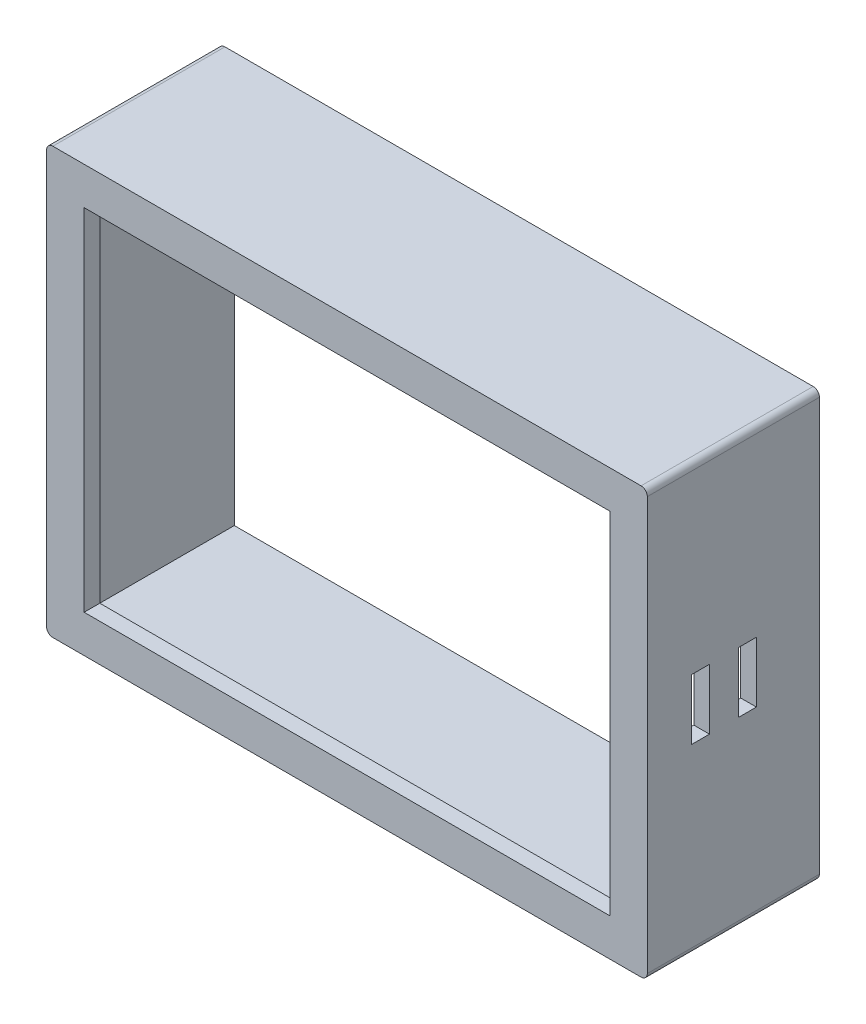
ISO-10303-21;
HEADER;
FILE_DESCRIPTION(('STEP AP214'),'2;1');
FILE_NAME('part.step','',(''),(''),'','','');
FILE_SCHEMA(('AUTOMOTIVE_DESIGN { 1 0 10303 214 1 1 1 1 }'));
ENDSEC;
DATA;
#1=APPLICATION_CONTEXT('core data for automotive mechanical design processes');
#2=APPLICATION_PROTOCOL_DEFINITION('international standard','automotive_design',2000,#1);
#3=PRODUCT_CONTEXT('',#1,'mechanical');
#4=PRODUCT('Part','Part','',(#3));
#5=PRODUCT_RELATED_PRODUCT_CATEGORY('part','',(#4));
#6=PRODUCT_DEFINITION_FORMATION('','',#4);
#7=PRODUCT_DEFINITION_CONTEXT('part definition',#1,'design');
#8=PRODUCT_DEFINITION('design','',#6,#7);
#9=PRODUCT_DEFINITION_SHAPE('','',#8);
#10=(LENGTH_UNIT() NAMED_UNIT(*) SI_UNIT(.MILLI.,.METRE.));
#11=(NAMED_UNIT(*) PLANE_ANGLE_UNIT() SI_UNIT($,.RADIAN.));
#12=(NAMED_UNIT(*) SI_UNIT($,.STERADIAN.) SOLID_ANGLE_UNIT());
#13=UNCERTAINTY_MEASURE_WITH_UNIT(LENGTH_MEASURE(1.E-05),#10,'distance_accuracy_value','');
#14=(GEOMETRIC_REPRESENTATION_CONTEXT(3) GLOBAL_UNCERTAINTY_ASSIGNED_CONTEXT((#13)) GLOBAL_UNIT_ASSIGNED_CONTEXT((#10,
#11,#12)) REPRESENTATION_CONTEXT('',''));
#15=CARTESIAN_POINT('',(0.,0.,0.));
#16=DIRECTION('',(0.,0.,1.));
#17=DIRECTION('',(1.,0.,0.));
#18=AXIS2_PLACEMENT_3D('',#15,#16,#17);
#19=CARTESIAN_POINT('',(-48.,34.,-2.5));
#20=DIRECTION('',(-1.,0.,0.));
#21=DIRECTION('',(0.,-1.,0.));
#22=AXIS2_PLACEMENT_3D('',#19,#20,#21);
#23=PLANE('',#22);
#24=DIRECTION('',(0.,1.,0.));
#25=VECTOR('',#24,1.);
#26=CARTESIAN_POINT('',(-48.,34.,-27.5));
#27=LINE('',#26,#25);
#28=CARTESIAN_POINT('',(-48.,-33.,-27.5));
#29=VERTEX_POINT('',#28);
#30=CARTESIAN_POINT('',(-48.,33.,-27.5));
#31=VERTEX_POINT('',#30);
#32=EDGE_CURVE('E293',#29,#31,#27,.T.);
#33=ORIENTED_EDGE('',*,*,#32,.F.);
#34=DIRECTION('',(0.,0.,1.));
#35=VECTOR('',#34,1.);
#36=CARTESIAN_POINT('',(-48.,-33.,-2.5));
#37=LINE('',#36,#35);
#38=CARTESIAN_POINT('',(-48.,-33.,0.));
#39=VERTEX_POINT('',#38);
#40=EDGE_CURVE('E351',#29,#39,#37,.T.);
#41=ORIENTED_EDGE('',*,*,#40,.T.);
#42=DIRECTION('',(0.,-1.,0.));
#43=VECTOR('',#42,1.);
#44=CARTESIAN_POINT('',(-48.,34.,0.));
#45=LINE('',#44,#43);
#46=CARTESIAN_POINT('',(-48.,33.,0.));
#47=VERTEX_POINT('',#46);
#48=EDGE_CURVE('E331',#47,#39,#45,.T.);
#49=ORIENTED_EDGE('',*,*,#48,.F.);
#50=DIRECTION('',(0.,0.,1.));
#51=VECTOR('',#50,1.);
#52=CARTESIAN_POINT('',(-48.,33.,-2.5));
#53=LINE('',#52,#51);
#54=EDGE_CURVE('E349',#47,#31,#53,.F.);
#55=ORIENTED_EDGE('',*,*,#54,.T.);
#56=EDGE_LOOP('',(#33,#41,#49,#55));
#57=FACE_BOUND('',#56,.T.);
#58=ADVANCED_FACE('F33',(#57),#23,.T.);
#59=CARTESIAN_POINT('',(-48.,34.,-2.5));
#60=DIRECTION('',(0.,1.,0.));
#61=DIRECTION('',(0.,0.,1.));
#62=AXIS2_PLACEMENT_3D('',#59,#60,#61);
#63=PLANE('',#62);
#64=DIRECTION('',(-1.,0.,0.));
#65=VECTOR('',#64,1.);
#66=CARTESIAN_POINT('',(-48.,34.,0.));
#67=LINE('',#66,#65);
#68=CARTESIAN_POINT('',(47.,34.,0.));
#69=VERTEX_POINT('',#68);
#70=CARTESIAN_POINT('',(-47.,34.,0.));
#71=VERTEX_POINT('',#70);
#72=EDGE_CURVE('E346',#69,#71,#67,.T.);
#73=ORIENTED_EDGE('',*,*,#72,.F.);
#74=DIRECTION('',(0.,0.,1.));
#75=VECTOR('',#74,1.);
#76=CARTESIAN_POINT('',(47.,34.,-2.5));
#77=LINE('',#76,#75);
#78=CARTESIAN_POINT('',(47.,34.,-27.5));
#79=VERTEX_POINT('',#78);
#80=EDGE_CURVE('E11',#69,#79,#77,.F.);
#81=ORIENTED_EDGE('',*,*,#80,.T.);
#82=DIRECTION('',(1.,0.,0.));
#83=VECTOR('',#82,1.);
#84=CARTESIAN_POINT('',(48.,34.,-27.5));
#85=LINE('',#84,#83);
#86=CARTESIAN_POINT('',(-47.,34.,-27.5));
#87=VERTEX_POINT('',#86);
#88=EDGE_CURVE('E296',#87,#79,#85,.T.);
#89=ORIENTED_EDGE('',*,*,#88,.F.);
#90=DIRECTION('',(0.,0.,1.));
#91=VECTOR('',#90,1.);
#92=CARTESIAN_POINT('',(-47.,34.,-2.5));
#93=LINE('',#92,#91);
#94=EDGE_CURVE('E41',#87,#71,#93,.T.);
#95=ORIENTED_EDGE('',*,*,#94,.T.);
#96=EDGE_LOOP('',(#73,#81,#89,#95));
#97=FACE_BOUND('',#96,.T.);
#98=ADVANCED_FACE('F384',(#97),#63,.T.);
#99=CARTESIAN_POINT('',(48.,34.,-2.5));
#100=DIRECTION('',(1.,0.,0.));
#101=DIRECTION('',(0.,1.,0.));
#102=AXIS2_PLACEMENT_3D('',#99,#100,#101);
#103=PLANE('',#102);
#104=DIRECTION('',(0.,0.,1.));
#105=VECTOR('',#104,1.);
#106=CARTESIAN_POINT('',(48.,4.83485360643903,-7.06477032196039));
#107=LINE('',#106,#105);
#108=CARTESIAN_POINT('',(48.,4.83485360643903,-9.92986875540593));
#109=VERTEX_POINT('',#108);
#110=CARTESIAN_POINT('',(48.,4.83485360643903,-7.06477032196039));
#111=VERTEX_POINT('',#110);
#112=EDGE_CURVE('E212',#109,#111,#107,.T.);
#113=ORIENTED_EDGE('',*,*,#112,.F.);
#114=DIRECTION('',(0.,1.,0.));
#115=VECTOR('',#114,1.);
#116=CARTESIAN_POINT('',(48.,4.83485360643903,-9.92986875540593));
#117=LINE('',#116,#115);
#118=CARTESIAN_POINT('',(48.,-4.83485360643902,-9.92986875540593));
#119=VERTEX_POINT('',#118);
#120=EDGE_CURVE('E223',#119,#109,#117,.T.);
#121=ORIENTED_EDGE('',*,*,#120,.F.);
#122=DIRECTION('',(0.,0.,-1.));
#123=VECTOR('',#122,1.);
#124=CARTESIAN_POINT('',(48.,-4.83485360643902,-7.06477032196039));
#125=LINE('',#124,#123);
#126=CARTESIAN_POINT('',(48.,-4.83485360643902,-7.06477032196039));
#127=VERTEX_POINT('',#126);
#128=EDGE_CURVE('E48',#127,#119,#125,.T.);
#129=ORIENTED_EDGE('',*,*,#128,.F.);
#130=DIRECTION('',(0.,-1.,0.));
#131=VECTOR('',#130,1.);
#132=CARTESIAN_POINT('',(48.,4.83485360643903,-7.06477032196039));
#133=LINE('',#132,#131);
#134=EDGE_CURVE('E219',#111,#127,#133,.T.);
#135=ORIENTED_EDGE('',*,*,#134,.F.);
#136=EDGE_LOOP('',(#113,#121,#129,#135));
#137=FACE_BOUND('',#136,.T.);
#138=DIRECTION('',(0.,1.,0.));
#139=VECTOR('',#138,1.);
#140=CARTESIAN_POINT('',(48.,4.83485360643903,-17.4298687554059));
#141=LINE('',#140,#139);
#142=CARTESIAN_POINT('',(48.,-4.83485360643902,-17.4298687554059));
#143=VERTEX_POINT('',#142);
#144=CARTESIAN_POINT('',(48.,4.83485360643903,-17.4298687554059));
#145=VERTEX_POINT('',#144);
#146=EDGE_CURVE('E239',#143,#145,#141,.T.);
#147=ORIENTED_EDGE('',*,*,#146,.F.);
#148=DIRECTION('',(0.,0.,-1.));
#149=VECTOR('',#148,1.);
#150=CARTESIAN_POINT('',(48.,-4.83485360643902,-14.5647703219604));
#151=LINE('',#150,#149);
#152=CARTESIAN_POINT('',(48.,-4.83485360643902,-14.5647703219604));
#153=VERTEX_POINT('',#152);
#154=EDGE_CURVE('E242',#153,#143,#151,.T.);
#155=ORIENTED_EDGE('',*,*,#154,.F.);
#156=DIRECTION('',(0.,-1.,0.));
#157=VECTOR('',#156,1.);
#158=CARTESIAN_POINT('',(48.,4.83485360643903,-14.5647703219604));
#159=LINE('',#158,#157);
#160=CARTESIAN_POINT('',(48.,4.83485360643903,-14.5647703219604));
#161=VERTEX_POINT('',#160);
#162=EDGE_CURVE('E56',#161,#153,#159,.T.);
#163=ORIENTED_EDGE('',*,*,#162,.F.);
#164=DIRECTION('',(0.,0.,1.));
#165=VECTOR('',#164,1.);
#166=CARTESIAN_POINT('',(48.,4.83485360643903,-14.5647703219604));
#167=LINE('',#166,#165);
#168=EDGE_CURVE('E236',#145,#161,#167,.T.);
#169=ORIENTED_EDGE('',*,*,#168,.F.);
#170=EDGE_LOOP('',(#147,#155,#163,#169));
#171=FACE_BOUND('',#170,.T.);
#172=DIRECTION('',(0.,1.,0.));
#173=VECTOR('',#172,1.);
#174=CARTESIAN_POINT('',(48.,34.,0.));
#175=LINE('',#174,#173);
#176=CARTESIAN_POINT('',(48.,-33.,0.));
#177=VERTEX_POINT('',#176);
#178=CARTESIAN_POINT('',(48.,33.,0.));
#179=VERTEX_POINT('',#178);
#180=EDGE_CURVE('E343',#177,#179,#175,.T.);
#181=ORIENTED_EDGE('',*,*,#180,.F.);
#182=DIRECTION('',(0.,0.,1.));
#183=VECTOR('',#182,1.);
#184=CARTESIAN_POINT('',(48.,-33.,-2.5));
#185=LINE('',#184,#183);
#186=CARTESIAN_POINT('',(48.,-33.,-27.5));
#187=VERTEX_POINT('',#186);
#188=EDGE_CURVE('E378',#177,#187,#185,.F.);
#189=ORIENTED_EDGE('',*,*,#188,.T.);
#190=DIRECTION('',(0.,-1.,0.));
#191=VECTOR('',#190,1.);
#192=CARTESIAN_POINT('',(48.,-34.,-27.5));
#193=LINE('',#192,#191);
#194=CARTESIAN_POINT('',(48.,33.,-27.5));
#195=VERTEX_POINT('',#194);
#196=EDGE_CURVE('E299',#195,#187,#193,.T.);
#197=ORIENTED_EDGE('',*,*,#196,.F.);
#198=DIRECTION('',(0.,0.,1.));
#199=VECTOR('',#198,1.);
#200=CARTESIAN_POINT('',(48.,33.,-2.5));
#201=LINE('',#200,#199);
#202=EDGE_CURVE('E375',#195,#179,#201,.T.);
#203=ORIENTED_EDGE('',*,*,#202,.T.);
#204=EDGE_LOOP('',(#181,#189,#197,#203));
#205=FACE_BOUND('',#204,.T.);
#206=ADVANCED_FACE('F398',(#137,#171,#205),#103,.T.);
#207=CARTESIAN_POINT('',(-48.,-34.,-2.5));
#208=DIRECTION('',(0.,-1.,0.));
#209=DIRECTION('',(0.,0.,-1.));
#210=AXIS2_PLACEMENT_3D('',#207,#208,#209);
#211=PLANE('',#210);
#212=DIRECTION('',(1.,0.,0.));
#213=VECTOR('',#212,1.);
#214=CARTESIAN_POINT('',(-48.,-34.,0.));
#215=LINE('',#214,#213);
#216=CARTESIAN_POINT('',(-47.,-34.,0.));
#217=VERTEX_POINT('',#216);
#218=CARTESIAN_POINT('',(47.,-34.,0.));
#219=VERTEX_POINT('',#218);
#220=EDGE_CURVE('E340',#217,#219,#215,.T.);
#221=ORIENTED_EDGE('',*,*,#220,.F.);
#222=DIRECTION('',(0.,0.,1.));
#223=VECTOR('',#222,1.);
#224=CARTESIAN_POINT('',(-47.,-34.,-2.5));
#225=LINE('',#224,#223);
#226=CARTESIAN_POINT('',(-47.,-34.,-27.5));
#227=VERTEX_POINT('',#226);
#228=EDGE_CURVE('E365',#217,#227,#225,.F.);
#229=ORIENTED_EDGE('',*,*,#228,.T.);
#230=DIRECTION('',(-1.,0.,0.));
#231=VECTOR('',#230,1.);
#232=CARTESIAN_POINT('',(-48.,-34.,-27.5));
#233=LINE('',#232,#231);
#234=CARTESIAN_POINT('',(47.,-34.,-27.5));
#235=VERTEX_POINT('',#234);
#236=EDGE_CURVE('E302',#235,#227,#233,.T.);
#237=ORIENTED_EDGE('',*,*,#236,.F.);
#238=DIRECTION('',(0.,0.,1.));
#239=VECTOR('',#238,1.);
#240=CARTESIAN_POINT('',(47.,-34.,-2.5));
#241=LINE('',#240,#239);
#242=EDGE_CURVE('E362',#235,#219,#241,.T.);
#243=ORIENTED_EDGE('',*,*,#242,.T.);
#244=EDGE_LOOP('',(#221,#229,#237,#243));
#245=FACE_BOUND('',#244,.T.);
#246=ADVANCED_FACE('F410',(#245),#211,.T.);
#247=CARTESIAN_POINT('',(0.,0.,-2.5));
#248=DIRECTION('',(0.,0.,1.));
#249=DIRECTION('',(1.,0.,0.));
#250=AXIS2_PLACEMENT_3D('',#247,#248,#249);
#251=PLANE('',#250);
#252=DIRECTION('',(1.,0.,0.));
#253=VECTOR('',#252,1.);
#254=CARTESIAN_POINT('',(-45.5,31.5,-2.5));
#255=LINE('',#254,#253);
#256=CARTESIAN_POINT('',(-45.5,31.5,-2.5));
#257=VERTEX_POINT('',#256);
#258=CARTESIAN_POINT('',(45.5,31.5,-2.5));
#259=VERTEX_POINT('',#258);
#260=EDGE_CURVE('E267',#257,#259,#255,.T.);
#261=ORIENTED_EDGE('',*,*,#260,.T.);
#262=DIRECTION('',(0.,-1.,0.));
#263=VECTOR('',#262,1.);
#264=CARTESIAN_POINT('',(45.5,31.5,-2.5));
#265=LINE('',#264,#263);
#266=CARTESIAN_POINT('',(45.5,-31.5,-2.5));
#267=VERTEX_POINT('',#266);
#268=EDGE_CURVE('E233',#259,#267,#265,.T.);
#269=ORIENTED_EDGE('',*,*,#268,.T.);
#270=DIRECTION('',(-1.,0.,0.));
#271=VECTOR('',#270,1.);
#272=CARTESIAN_POINT('',(45.5,-31.5,-2.5));
#273=LINE('',#272,#271);
#274=CARTESIAN_POINT('',(-45.5,-31.5,-2.5));
#275=VERTEX_POINT('',#274);
#276=EDGE_CURVE('E277',#267,#275,#273,.T.);
#277=ORIENTED_EDGE('',*,*,#276,.T.);
#278=DIRECTION('',(0.,1.,0.));
#279=VECTOR('',#278,1.);
#280=CARTESIAN_POINT('',(-45.5,-31.5,-2.5));
#281=LINE('',#280,#279);
#282=EDGE_CURVE('E280',#275,#257,#281,.T.);
#283=ORIENTED_EDGE('',*,*,#282,.T.);
#284=EDGE_LOOP('',(#261,#269,#277,#283));
#285=FACE_BOUND('',#284,.T.);
#286=DIRECTION('',(1.,0.,0.));
#287=VECTOR('',#286,1.);
#288=CARTESIAN_POINT('',(-42.,-28.,-2.5));
#289=LINE('',#288,#287);
#290=CARTESIAN_POINT('',(-42.,-28.,-2.5));
#291=VERTEX_POINT('',#290);
#292=CARTESIAN_POINT('',(42.,-28.,-2.5));
#293=VERTEX_POINT('',#292);
#294=EDGE_CURVE('E316',#291,#293,#289,.T.);
#295=ORIENTED_EDGE('',*,*,#294,.T.);
#296=DIRECTION('',(0.,1.,0.));
#297=VECTOR('',#296,1.);
#298=CARTESIAN_POINT('',(42.,28.,-2.5));
#299=LINE('',#298,#297);
#300=CARTESIAN_POINT('',(42.,28.,-2.5));
#301=VERTEX_POINT('',#300);
#302=EDGE_CURVE('E306',#293,#301,#299,.T.);
#303=ORIENTED_EDGE('',*,*,#302,.T.);
#304=DIRECTION('',(-1.,0.,0.));
#305=VECTOR('',#304,1.);
#306=CARTESIAN_POINT('',(-42.,28.,-2.5));
#307=LINE('',#306,#305);
#308=CARTESIAN_POINT('',(-42.,28.,-2.5));
#309=VERTEX_POINT('',#308);
#310=EDGE_CURVE('E309',#301,#309,#307,.T.);
#311=ORIENTED_EDGE('',*,*,#310,.T.);
#312=DIRECTION('',(0.,-1.,0.));
#313=VECTOR('',#312,1.);
#314=CARTESIAN_POINT('',(-42.,28.,-2.5));
#315=LINE('',#314,#313);
#316=EDGE_CURVE('E313',#309,#291,#315,.T.);
#317=ORIENTED_EDGE('',*,*,#316,.T.);
#318=EDGE_LOOP('',(#295,#303,#311,#317));
#319=FACE_BOUND('',#318,.T.);
#320=ADVANCED_FACE('F569',(#285,#319),#251,.F.);
#321=CARTESIAN_POINT('',(0.,0.,0.));
#322=DIRECTION('',(0.,0.,1.));
#323=DIRECTION('',(1.,0.,0.));
#324=AXIS2_PLACEMENT_3D('',#321,#322,#323);
#325=PLANE('',#324);
#326=DIRECTION('',(0.,1.,0.));
#327=VECTOR('',#326,1.);
#328=CARTESIAN_POINT('',(42.,28.,0.));
#329=LINE('',#328,#327);
#330=CARTESIAN_POINT('',(42.,-28.,0.));
#331=VERTEX_POINT('',#330);
#332=CARTESIAN_POINT('',(42.,28.,0.));
#333=VERTEX_POINT('',#332);
#334=EDGE_CURVE('E305',#331,#333,#329,.T.);
#335=ORIENTED_EDGE('',*,*,#334,.F.);
#336=DIRECTION('',(1.,0.,0.));
#337=VECTOR('',#336,1.);
#338=CARTESIAN_POINT('',(-42.,-28.,0.));
#339=LINE('',#338,#337);
#340=CARTESIAN_POINT('',(-42.,-28.,0.));
#341=VERTEX_POINT('',#340);
#342=EDGE_CURVE('E310',#341,#331,#339,.T.);
#343=ORIENTED_EDGE('',*,*,#342,.F.);
#344=DIRECTION('',(0.,-1.,0.));
#345=VECTOR('',#344,1.);
#346=CARTESIAN_POINT('',(-42.,28.,0.));
#347=LINE('',#346,#345);
#348=CARTESIAN_POINT('',(-42.,28.,0.));
#349=VERTEX_POINT('',#348);
#350=EDGE_CURVE('E324',#349,#341,#347,.T.);
#351=ORIENTED_EDGE('',*,*,#350,.F.);
#352=DIRECTION('',(-1.,0.,0.));
#353=VECTOR('',#352,1.);
#354=CARTESIAN_POINT('',(-42.,28.,0.));
#355=LINE('',#354,#353);
#356=EDGE_CURVE('E321',#333,#349,#355,.T.);
#357=ORIENTED_EDGE('',*,*,#356,.F.);
#358=EDGE_LOOP('',(#335,#343,#351,#357));
#359=FACE_BOUND('',#358,.T.);
#360=ORIENTED_EDGE('',*,*,#48,.T.);
#361=CARTESIAN_POINT('',(-47.,-33.,0.));
#362=DIRECTION('',(0.,0.,1.));
#363=DIRECTION('',(1.,0.,0.));
#364=AXIS2_PLACEMENT_3D('',#361,#362,#363);
#365=CIRCLE('',#364,1.);
#366=EDGE_CURVE('E360',#39,#217,#365,.T.);
#367=ORIENTED_EDGE('',*,*,#366,.T.);
#368=ORIENTED_EDGE('',*,*,#220,.T.);
#369=CARTESIAN_POINT('',(47.,-33.,0.));
#370=DIRECTION('',(0.,0.,1.));
#371=DIRECTION('',(1.,0.,0.));
#372=AXIS2_PLACEMENT_3D('',#369,#370,#371);
#373=CIRCLE('',#372,1.);
#374=EDGE_CURVE('E358',#219,#177,#373,.T.);
#375=ORIENTED_EDGE('',*,*,#374,.T.);
#376=ORIENTED_EDGE('',*,*,#180,.T.);
#377=CARTESIAN_POINT('',(47.,33.,0.));
#378=DIRECTION('',(0.,0.,1.));
#379=DIRECTION('',(1.,0.,0.));
#380=AXIS2_PLACEMENT_3D('',#377,#378,#379);
#381=CIRCLE('',#380,1.);
#382=EDGE_CURVE('E356',#179,#69,#381,.T.);
#383=ORIENTED_EDGE('',*,*,#382,.T.);
#384=ORIENTED_EDGE('',*,*,#72,.T.);
#385=CARTESIAN_POINT('',(-47.,33.,0.));
#386=DIRECTION('',(0.,0.,1.));
#387=DIRECTION('',(1.,0.,0.));
#388=AXIS2_PLACEMENT_3D('',#385,#386,#387);
#389=CIRCLE('',#388,1.);
#390=EDGE_CURVE('E354',#71,#47,#389,.T.);
#391=ORIENTED_EDGE('',*,*,#390,.T.);
#392=EDGE_LOOP('',(#360,#367,#368,#375,#376,#383,#384,#391));
#393=FACE_BOUND('',#392,.T.);
#394=ADVANCED_FACE('F389',(#359,#393),#325,.T.);
#395=CARTESIAN_POINT('',(42.,28.,-2.5));
#396=DIRECTION('',(1.,0.,0.));
#397=DIRECTION('',(0.,1.,0.));
#398=AXIS2_PLACEMENT_3D('',#395,#396,#397);
#399=PLANE('',#398);
#400=ORIENTED_EDGE('',*,*,#334,.T.);
#401=DIRECTION('',(0.,0.,1.));
#402=VECTOR('',#401,1.);
#403=CARTESIAN_POINT('',(42.,28.,-2.5));
#404=LINE('',#403,#402);
#405=EDGE_CURVE('E319',#301,#333,#404,.T.);
#406=ORIENTED_EDGE('',*,*,#405,.F.);
#407=ORIENTED_EDGE('',*,*,#302,.F.);
#408=DIRECTION('',(0.,0.,1.));
#409=VECTOR('',#408,1.);
#410=CARTESIAN_POINT('',(42.,-28.,-2.5));
#411=LINE('',#410,#409);
#412=EDGE_CURVE('E329',#293,#331,#411,.T.);
#413=ORIENTED_EDGE('',*,*,#412,.T.);
#414=EDGE_LOOP('',(#400,#406,#407,#413));
#415=FACE_BOUND('',#414,.T.);
#416=ADVANCED_FACE('F558',(#415),#399,.F.);
#417=CARTESIAN_POINT('',(-42.,-28.,-2.5));
#418=DIRECTION('',(0.,-1.,0.));
#419=DIRECTION('',(0.,0.,-1.));
#420=AXIS2_PLACEMENT_3D('',#417,#418,#419);
#421=PLANE('',#420);
#422=ORIENTED_EDGE('',*,*,#342,.T.);
#423=ORIENTED_EDGE('',*,*,#412,.F.);
#424=ORIENTED_EDGE('',*,*,#294,.F.);
#425=DIRECTION('',(0.,0.,1.));
#426=VECTOR('',#425,1.);
#427=CARTESIAN_POINT('',(-42.,-28.,-2.5));
#428=LINE('',#427,#426);
#429=EDGE_CURVE('E332',#291,#341,#428,.T.);
#430=ORIENTED_EDGE('',*,*,#429,.T.);
#431=EDGE_LOOP('',(#422,#423,#424,#430));
#432=FACE_BOUND('',#431,.T.);
#433=ADVANCED_FACE('F554',(#432),#421,.F.);
#434=CARTESIAN_POINT('',(-42.,28.,-2.5));
#435=DIRECTION('',(-1.,0.,0.));
#436=DIRECTION('',(0.,0.,1.));
#437=AXIS2_PLACEMENT_3D('',#434,#435,#436);
#438=PLANE('',#437);
#439=ORIENTED_EDGE('',*,*,#350,.T.);
#440=ORIENTED_EDGE('',*,*,#429,.F.);
#441=ORIENTED_EDGE('',*,*,#316,.F.);
#442=DIRECTION('',(0.,0.,1.));
#443=VECTOR('',#442,1.);
#444=CARTESIAN_POINT('',(-42.,28.,-2.5));
#445=LINE('',#444,#443);
#446=EDGE_CURVE('E334',#309,#349,#445,.T.);
#447=ORIENTED_EDGE('',*,*,#446,.T.);
#448=EDGE_LOOP('',(#439,#440,#441,#447));
#449=FACE_BOUND('',#448,.T.);
#450=ADVANCED_FACE('F557',(#449),#438,.F.);
#451=CARTESIAN_POINT('',(-42.,28.,-2.5));
#452=DIRECTION('',(0.,1.,0.));
#453=DIRECTION('',(0.,0.,1.));
#454=AXIS2_PLACEMENT_3D('',#451,#452,#453);
#455=PLANE('',#454);
#456=ORIENTED_EDGE('',*,*,#356,.T.);
#457=ORIENTED_EDGE('',*,*,#446,.F.);
#458=ORIENTED_EDGE('',*,*,#310,.F.);
#459=ORIENTED_EDGE('',*,*,#405,.T.);
#460=EDGE_LOOP('',(#456,#457,#458,#459));
#461=FACE_BOUND('',#460,.T.);
#462=ADVANCED_FACE('F553',(#461),#455,.F.);
#463=CARTESIAN_POINT('',(0.,0.,-27.5));
#464=DIRECTION('',(0.,0.,1.));
#465=DIRECTION('',(1.,0.,0.));
#466=AXIS2_PLACEMENT_3D('',#463,#464,#465);
#467=PLANE('',#466);
#468=ORIENTED_EDGE('',*,*,#236,.T.);
#469=CARTESIAN_POINT('',(-47.,-33.,-27.5));
#470=DIRECTION('',(0.,0.,1.));
#471=DIRECTION('',(1.,0.,0.));
#472=AXIS2_PLACEMENT_3D('',#469,#470,#471);
#473=CIRCLE('',#472,1.);
#474=EDGE_CURVE('E373',#227,#29,#473,.F.);
#475=ORIENTED_EDGE('',*,*,#474,.T.);
#476=ORIENTED_EDGE('',*,*,#32,.T.);
#477=CARTESIAN_POINT('',(-47.,33.,-27.5));
#478=DIRECTION('',(0.,0.,1.));
#479=DIRECTION('',(1.,0.,0.));
#480=AXIS2_PLACEMENT_3D('',#477,#478,#479);
#481=CIRCLE('',#480,1.);
#482=EDGE_CURVE('E367',#31,#87,#481,.F.);
#483=ORIENTED_EDGE('',*,*,#482,.T.);
#484=ORIENTED_EDGE('',*,*,#88,.T.);
#485=CARTESIAN_POINT('',(47.,33.,-27.5));
#486=DIRECTION('',(0.,0.,1.));
#487=DIRECTION('',(1.,0.,0.));
#488=AXIS2_PLACEMENT_3D('',#485,#486,#487);
#489=CIRCLE('',#488,1.);
#490=EDGE_CURVE('E369',#79,#195,#489,.F.);
#491=ORIENTED_EDGE('',*,*,#490,.T.);
#492=ORIENTED_EDGE('',*,*,#196,.T.);
#493=CARTESIAN_POINT('',(47.,-33.,-27.5));
#494=DIRECTION('',(0.,0.,1.));
#495=DIRECTION('',(1.,0.,0.));
#496=AXIS2_PLACEMENT_3D('',#493,#494,#495);
#497=CIRCLE('',#496,1.);
#498=EDGE_CURVE('E371',#187,#235,#497,.F.);
#499=ORIENTED_EDGE('',*,*,#498,.T.);
#500=EDGE_LOOP('',(#468,#475,#476,#483,#484,#491,#492,#499));
#501=FACE_BOUND('',#500,.T.);
#502=DIRECTION('',(0.,-1.,0.));
#503=VECTOR('',#502,1.);
#504=CARTESIAN_POINT('',(45.5,31.5,-27.5));
#505=LINE('',#504,#503);
#506=CARTESIAN_POINT('',(45.5,31.5,-27.5));
#507=VERTEX_POINT('',#506);
#508=CARTESIAN_POINT('',(45.5,-31.5,-27.5));
#509=VERTEX_POINT('',#508);
#510=EDGE_CURVE('E264',#507,#509,#505,.T.);
#511=ORIENTED_EDGE('',*,*,#510,.F.);
#512=DIRECTION('',(1.,0.,0.));
#513=VECTOR('',#512,1.);
#514=CARTESIAN_POINT('',(-45.5,31.5,-27.5));
#515=LINE('',#514,#513);
#516=CARTESIAN_POINT('',(-45.5,31.5,-27.5));
#517=VERTEX_POINT('',#516);
#518=EDGE_CURVE('E272',#517,#507,#515,.T.);
#519=ORIENTED_EDGE('',*,*,#518,.F.);
#520=DIRECTION('',(0.,1.,0.));
#521=VECTOR('',#520,1.);
#522=CARTESIAN_POINT('',(-45.5,-31.5,-27.5));
#523=LINE('',#522,#521);
#524=CARTESIAN_POINT('',(-45.5,-31.5,-27.5));
#525=VERTEX_POINT('',#524);
#526=EDGE_CURVE('E269',#525,#517,#523,.T.);
#527=ORIENTED_EDGE('',*,*,#526,.F.);
#528=DIRECTION('',(-1.,0.,0.));
#529=VECTOR('',#528,1.);
#530=CARTESIAN_POINT('',(45.5,-31.5,-27.5));
#531=LINE('',#530,#529);
#532=EDGE_CURVE('E266',#509,#525,#531,.T.);
#533=ORIENTED_EDGE('',*,*,#532,.F.);
#534=EDGE_LOOP('',(#511,#519,#527,#533));
#535=FACE_BOUND('',#534,.T.);
#536=ADVANCED_FACE('F402',(#501,#535),#467,.F.);
#537=CARTESIAN_POINT('',(45.5,31.5,-27.5));
#538=DIRECTION('',(-1.,0.,0.));
#539=DIRECTION('',(0.,-1.,0.));
#540=AXIS2_PLACEMENT_3D('',#537,#538,#539);
#541=PLANE('',#540);
#542=DIRECTION('',(0.,0.,1.));
#543=VECTOR('',#542,1.);
#544=CARTESIAN_POINT('',(45.5,4.83485360643903,-7.06477032196039));
#545=LINE('',#544,#543);
#546=CARTESIAN_POINT('',(45.5,4.83485360643903,-9.92986875540593));
#547=VERTEX_POINT('',#546);
#548=CARTESIAN_POINT('',(45.5,4.83485360643903,-7.06477032196039));
#549=VERTEX_POINT('',#548);
#550=EDGE_CURVE('E209',#547,#549,#545,.T.);
#551=ORIENTED_EDGE('',*,*,#550,.T.);
#552=DIRECTION('',(0.,-1.,0.));
#553=VECTOR('',#552,1.);
#554=CARTESIAN_POINT('',(45.5,4.83485360643903,-7.06477032196039));
#555=LINE('',#554,#553);
#556=CARTESIAN_POINT('',(45.5,-4.83485360643903,-7.06477032196039));
#557=VERTEX_POINT('',#556);
#558=EDGE_CURVE('E195',#549,#557,#555,.T.);
#559=ORIENTED_EDGE('',*,*,#558,.T.);
#560=DIRECTION('',(0.,0.,-1.));
#561=VECTOR('',#560,1.);
#562=CARTESIAN_POINT('',(45.5,-4.83485360643902,-7.06477032196039));
#563=LINE('',#562,#561);
#564=CARTESIAN_POINT('',(45.5,-4.83485360643902,-9.92986875540593));
#565=VERTEX_POINT('',#564);
#566=EDGE_CURVE('E228',#557,#565,#563,.T.);
#567=ORIENTED_EDGE('',*,*,#566,.T.);
#568=DIRECTION('',(0.,1.,0.));
#569=VECTOR('',#568,1.);
#570=CARTESIAN_POINT('',(45.5,4.83485360643903,-9.92986875540593));
#571=LINE('',#570,#569);
#572=EDGE_CURVE('E217',#565,#547,#571,.T.);
#573=ORIENTED_EDGE('',*,*,#572,.T.);
#574=EDGE_LOOP('',(#551,#559,#567,#573));
#575=FACE_BOUND('',#574,.T.);
#576=DIRECTION('',(0.,1.,0.));
#577=VECTOR('',#576,1.);
#578=CARTESIAN_POINT('',(45.5,4.83485360643903,-17.4298687554059));
#579=LINE('',#578,#577);
#580=CARTESIAN_POINT('',(45.5,-4.83485360643902,-17.4298687554059));
#581=VERTEX_POINT('',#580);
#582=CARTESIAN_POINT('',(45.5,4.83485360643903,-17.4298687554059));
#583=VERTEX_POINT('',#582);
#584=EDGE_CURVE('E235',#581,#583,#579,.T.);
#585=ORIENTED_EDGE('',*,*,#584,.T.);
#586=DIRECTION('',(0.,0.,1.));
#587=VECTOR('',#586,1.);
#588=CARTESIAN_POINT('',(45.5,4.83485360643903,-14.5647703219604));
#589=LINE('',#588,#587);
#590=CARTESIAN_POINT('',(45.5,4.83485360643903,-14.5647703219604));
#591=VERTEX_POINT('',#590);
#592=EDGE_CURVE('E257',#583,#591,#589,.T.);
#593=ORIENTED_EDGE('',*,*,#592,.T.);
#594=DIRECTION('',(0.,-1.,0.));
#595=VECTOR('',#594,1.);
#596=CARTESIAN_POINT('',(45.5,4.83485360643903,-14.5647703219604));
#597=LINE('',#596,#595);
#598=CARTESIAN_POINT('',(45.5,-4.83485360643903,-14.5647703219604));
#599=VERTEX_POINT('',#598);
#600=EDGE_CURVE('E253',#591,#599,#597,.T.);
#601=ORIENTED_EDGE('',*,*,#600,.T.);
#602=DIRECTION('',(0.,0.,-1.));
#603=VECTOR('',#602,1.);
#604=CARTESIAN_POINT('',(45.5,-4.83485360643902,-14.5647703219604));
#605=LINE('',#604,#603);
#606=EDGE_CURVE('E248',#599,#581,#605,.T.);
#607=ORIENTED_EDGE('',*,*,#606,.T.);
#608=EDGE_LOOP('',(#585,#593,#601,#607));
#609=FACE_BOUND('',#608,.T.);
#610=ORIENTED_EDGE('',*,*,#268,.F.);
#611=DIRECTION('',(0.,0.,1.));
#612=VECTOR('',#611,1.);
#613=CARTESIAN_POINT('',(45.5,31.5,-27.5));
#614=LINE('',#613,#612);
#615=EDGE_CURVE('E274',#507,#259,#614,.T.);
#616=ORIENTED_EDGE('',*,*,#615,.F.);
#617=ORIENTED_EDGE('',*,*,#510,.T.);
#618=DIRECTION('',(0.,0.,1.));
#619=VECTOR('',#618,1.);
#620=CARTESIAN_POINT('',(45.5,-31.5,-27.5));
#621=LINE('',#620,#619);
#622=EDGE_CURVE('E290',#509,#267,#621,.T.);
#623=ORIENTED_EDGE('',*,*,#622,.T.);
#624=EDGE_LOOP('',(#610,#616,#617,#623));
#625=FACE_BOUND('',#624,.T.);
#626=ADVANCED_FACE('F215',(#575,#609,#625),#541,.T.);
#627=CARTESIAN_POINT('',(45.5,-31.5,-27.5));
#628=DIRECTION('',(0.,1.,0.));
#629=DIRECTION('',(0.,0.,1.));
#630=AXIS2_PLACEMENT_3D('',#627,#628,#629);
#631=PLANE('',#630);
#632=ORIENTED_EDGE('',*,*,#276,.F.);
#633=ORIENTED_EDGE('',*,*,#622,.F.);
#634=ORIENTED_EDGE('',*,*,#532,.T.);
#635=DIRECTION('',(0.,0.,1.));
#636=VECTOR('',#635,1.);
#637=CARTESIAN_POINT('',(-45.5,-31.5,-27.5));
#638=LINE('',#637,#636);
#639=EDGE_CURVE('E288',#525,#275,#638,.T.);
#640=ORIENTED_EDGE('',*,*,#639,.T.);
#641=EDGE_LOOP('',(#632,#633,#634,#640));
#642=FACE_BOUND('',#641,.T.);
#643=ADVANCED_FACE('F470',(#642),#631,.T.);
#644=CARTESIAN_POINT('',(-45.5,-31.5,-27.5));
#645=DIRECTION('',(1.,0.,0.));
#646=DIRECTION('',(0.,1.,0.));
#647=AXIS2_PLACEMENT_3D('',#644,#645,#646);
#648=PLANE('',#647);
#649=ORIENTED_EDGE('',*,*,#282,.F.);
#650=ORIENTED_EDGE('',*,*,#639,.F.);
#651=ORIENTED_EDGE('',*,*,#526,.T.);
#652=DIRECTION('',(0.,0.,1.));
#653=VECTOR('',#652,1.);
#654=CARTESIAN_POINT('',(-45.5,31.5,-27.5));
#655=LINE('',#654,#653);
#656=EDGE_CURVE('E286',#517,#257,#655,.T.);
#657=ORIENTED_EDGE('',*,*,#656,.T.);
#658=EDGE_LOOP('',(#649,#650,#651,#657));
#659=FACE_BOUND('',#658,.T.);
#660=ADVANCED_FACE('F545',(#659),#648,.T.);
#661=CARTESIAN_POINT('',(-45.5,31.5,-27.5));
#662=DIRECTION('',(0.,-1.,0.));
#663=DIRECTION('',(0.,0.,-1.));
#664=AXIS2_PLACEMENT_3D('',#661,#662,#663);
#665=PLANE('',#664);
#666=ORIENTED_EDGE('',*,*,#260,.F.);
#667=ORIENTED_EDGE('',*,*,#656,.F.);
#668=ORIENTED_EDGE('',*,*,#518,.T.);
#669=ORIENTED_EDGE('',*,*,#615,.T.);
#670=EDGE_LOOP('',(#666,#667,#668,#669));
#671=FACE_BOUND('',#670,.T.);
#672=ADVANCED_FACE('F439',(#671),#665,.T.);
#673=CARTESIAN_POINT('',(-47.,-33.,-2.5));
#674=DIRECTION('',(0.,0.,1.));
#675=DIRECTION('',(1.,0.,0.));
#676=AXIS2_PLACEMENT_3D('',#673,#674,#675);
#677=CYLINDRICAL_SURFACE('',#676,1.);
#678=ORIENTED_EDGE('',*,*,#474,.F.);
#679=ORIENTED_EDGE('',*,*,#228,.F.);
#680=ORIENTED_EDGE('',*,*,#366,.F.);
#681=ORIENTED_EDGE('',*,*,#40,.F.);
#682=EDGE_LOOP('',(#678,#679,#680,#681));
#683=FACE_BOUND('',#682,.T.);
#684=ADVANCED_FACE('F415',(#683),#677,.T.);
#685=CARTESIAN_POINT('',(47.,-33.,-2.5));
#686=DIRECTION('',(0.,0.,1.));
#687=DIRECTION('',(1.,0.,0.));
#688=AXIS2_PLACEMENT_3D('',#685,#686,#687);
#689=CYLINDRICAL_SURFACE('',#688,1.);
#690=ORIENTED_EDGE('',*,*,#498,.F.);
#691=ORIENTED_EDGE('',*,*,#188,.F.);
#692=ORIENTED_EDGE('',*,*,#374,.F.);
#693=ORIENTED_EDGE('',*,*,#242,.F.);
#694=EDGE_LOOP('',(#690,#691,#692,#693));
#695=FACE_BOUND('',#694,.T.);
#696=ADVANCED_FACE('F407',(#695),#689,.T.);
#697=CARTESIAN_POINT('',(47.,33.,-2.5));
#698=DIRECTION('',(0.,0.,1.));
#699=DIRECTION('',(1.,0.,0.));
#700=AXIS2_PLACEMENT_3D('',#697,#698,#699);
#701=CYLINDRICAL_SURFACE('',#700,1.);
#702=ORIENTED_EDGE('',*,*,#490,.F.);
#703=ORIENTED_EDGE('',*,*,#80,.F.);
#704=ORIENTED_EDGE('',*,*,#382,.F.);
#705=ORIENTED_EDGE('',*,*,#202,.F.);
#706=EDGE_LOOP('',(#702,#703,#704,#705));
#707=FACE_BOUND('',#706,.T.);
#708=ADVANCED_FACE('F395',(#707),#701,.T.);
#709=CARTESIAN_POINT('',(-47.,33.,-2.5));
#710=DIRECTION('',(0.,0.,1.));
#711=DIRECTION('',(1.,0.,0.));
#712=AXIS2_PLACEMENT_3D('',#709,#710,#711);
#713=CYLINDRICAL_SURFACE('',#712,1.);
#714=ORIENTED_EDGE('',*,*,#482,.F.);
#715=ORIENTED_EDGE('',*,*,#54,.F.);
#716=ORIENTED_EDGE('',*,*,#390,.F.);
#717=ORIENTED_EDGE('',*,*,#94,.F.);
#718=EDGE_LOOP('',(#714,#715,#716,#717));
#719=FACE_BOUND('',#718,.T.);
#720=ADVANCED_FACE('F35',(#719),#713,.T.);
#721=CARTESIAN_POINT('',(35.414761945491,4.83485360643903,-17.4298687554059));
#722=DIRECTION('',(0.,0.,-1.));
#723=DIRECTION('',(-1.,0.,0.));
#724=AXIS2_PLACEMENT_3D('',#721,#722,#723);
#725=PLANE('',#724);
#726=DIRECTION('',(1.,0.,0.));
#727=VECTOR('',#726,1.);
#728=CARTESIAN_POINT('',(35.414761945491,-4.83485360643903,-17.4298687554059));
#729=LINE('',#728,#727);
#730=EDGE_CURVE('E251',#581,#143,#729,.T.);
#731=ORIENTED_EDGE('',*,*,#730,.T.);
#732=ORIENTED_EDGE('',*,*,#146,.T.);
#733=DIRECTION('',(1.,0.,0.));
#734=VECTOR('',#733,1.);
#735=CARTESIAN_POINT('',(35.414761945491,4.83485360643903,-17.4298687554059));
#736=LINE('',#735,#734);
#737=EDGE_CURVE('E247',#583,#145,#736,.T.);
#738=ORIENTED_EDGE('',*,*,#737,.F.);
#739=ORIENTED_EDGE('',*,*,#584,.F.);
#740=EDGE_LOOP('',(#731,#732,#738,#739));
#741=FACE_BOUND('',#740,.T.);
#742=ADVANCED_FACE('F420',(#741),#725,.F.);
#743=CARTESIAN_POINT('',(35.414761945491,4.83485360643903,-14.5647703219604));
#744=DIRECTION('',(0.,1.,0.));
#745=DIRECTION('',(-1.,0.,0.));
#746=AXIS2_PLACEMENT_3D('',#743,#744,#745);
#747=PLANE('',#746);
#748=ORIENTED_EDGE('',*,*,#737,.T.);
#749=ORIENTED_EDGE('',*,*,#168,.T.);
#750=DIRECTION('',(1.,0.,0.));
#751=VECTOR('',#750,1.);
#752=CARTESIAN_POINT('',(35.414761945491,4.83485360643903,-14.5647703219604));
#753=LINE('',#752,#751);
#754=EDGE_CURVE('E256',#591,#161,#753,.T.);
#755=ORIENTED_EDGE('',*,*,#754,.F.);
#756=ORIENTED_EDGE('',*,*,#592,.F.);
#757=EDGE_LOOP('',(#748,#749,#755,#756));
#758=FACE_BOUND('',#757,.T.);
#759=ADVANCED_FACE('F425',(#758),#747,.F.);
#760=CARTESIAN_POINT('',(35.414761945491,4.83485360643903,-14.5647703219604));
#761=DIRECTION('',(0.,0.,1.));
#762=DIRECTION('',(1.,0.,0.));
#763=AXIS2_PLACEMENT_3D('',#760,#761,#762);
#764=PLANE('',#763);
#765=ORIENTED_EDGE('',*,*,#754,.T.);
#766=ORIENTED_EDGE('',*,*,#162,.T.);
#767=DIRECTION('',(1.,0.,0.));
#768=VECTOR('',#767,1.);
#769=CARTESIAN_POINT('',(35.414761945491,-4.83485360643903,-14.5647703219604));
#770=LINE('',#769,#768);
#771=EDGE_CURVE('E252',#599,#153,#770,.T.);
#772=ORIENTED_EDGE('',*,*,#771,.F.);
#773=ORIENTED_EDGE('',*,*,#600,.F.);
#774=EDGE_LOOP('',(#765,#766,#772,#773));
#775=FACE_BOUND('',#774,.T.);
#776=ADVANCED_FACE('F485',(#775),#764,.F.);
#777=CARTESIAN_POINT('',(35.414761945491,-4.83485360643903,-14.5647703219604));
#778=DIRECTION('',(0.,-1.,0.));
#779=DIRECTION('',(1.,0.,0.));
#780=AXIS2_PLACEMENT_3D('',#777,#778,#779);
#781=PLANE('',#780);
#782=ORIENTED_EDGE('',*,*,#771,.T.);
#783=ORIENTED_EDGE('',*,*,#154,.T.);
#784=ORIENTED_EDGE('',*,*,#730,.F.);
#785=ORIENTED_EDGE('',*,*,#606,.F.);
#786=EDGE_LOOP('',(#782,#783,#784,#785));
#787=FACE_BOUND('',#786,.T.);
#788=ADVANCED_FACE('F495',(#787),#781,.F.);
#789=CARTESIAN_POINT('',(35.414761945491,4.83485360643903,-7.06477032196039));
#790=DIRECTION('',(0.,1.,0.));
#791=DIRECTION('',(-1.,0.,0.));
#792=AXIS2_PLACEMENT_3D('',#789,#790,#791);
#793=PLANE('',#792);
#794=DIRECTION('',(1.,0.,0.));
#795=VECTOR('',#794,1.);
#796=CARTESIAN_POINT('',(35.414761945491,4.83485360643903,-9.92986875540593));
#797=LINE('',#796,#795);
#798=EDGE_CURVE('E226',#547,#109,#797,.T.);
#799=ORIENTED_EDGE('',*,*,#798,.T.);
#800=ORIENTED_EDGE('',*,*,#112,.T.);
#801=DIRECTION('',(1.,0.,0.));
#802=VECTOR('',#801,1.);
#803=CARTESIAN_POINT('',(35.414761945491,4.83485360643903,-7.06477032196039));
#804=LINE('',#803,#802);
#805=EDGE_CURVE('E199',#549,#111,#804,.T.);
#806=ORIENTED_EDGE('',*,*,#805,.F.);
#807=ORIENTED_EDGE('',*,*,#550,.F.);
#808=EDGE_LOOP('',(#799,#800,#806,#807));
#809=FACE_BOUND('',#808,.T.);
#810=ADVANCED_FACE('F208',(#809),#793,.F.);
#811=CARTESIAN_POINT('',(35.414761945491,4.83485360643903,-7.06477032196039));
#812=DIRECTION('',(0.,0.,1.));
#813=DIRECTION('',(1.,0.,0.));
#814=AXIS2_PLACEMENT_3D('',#811,#812,#813);
#815=PLANE('',#814);
#816=ORIENTED_EDGE('',*,*,#805,.T.);
#817=ORIENTED_EDGE('',*,*,#134,.T.);
#818=DIRECTION('',(1.,0.,0.));
#819=VECTOR('',#818,1.);
#820=CARTESIAN_POINT('',(35.414761945491,-4.83485360643903,-7.06477032196039));
#821=LINE('',#820,#819);
#822=EDGE_CURVE('E201',#557,#127,#821,.T.);
#823=ORIENTED_EDGE('',*,*,#822,.F.);
#824=ORIENTED_EDGE('',*,*,#558,.F.);
#825=EDGE_LOOP('',(#816,#817,#823,#824));
#826=FACE_BOUND('',#825,.T.);
#827=ADVANCED_FACE('F197',(#826),#815,.F.);
#828=CARTESIAN_POINT('',(35.414761945491,-4.83485360643903,-7.06477032196039));
#829=DIRECTION('',(0.,-1.,0.));
#830=DIRECTION('',(1.,0.,0.));
#831=AXIS2_PLACEMENT_3D('',#828,#829,#830);
#832=PLANE('',#831);
#833=ORIENTED_EDGE('',*,*,#822,.T.);
#834=ORIENTED_EDGE('',*,*,#128,.T.);
#835=DIRECTION('',(1.,0.,0.));
#836=VECTOR('',#835,1.);
#837=CARTESIAN_POINT('',(35.414761945491,-4.83485360643903,-9.92986875540593));
#838=LINE('',#837,#836);
#839=EDGE_CURVE('E227',#565,#119,#838,.T.);
#840=ORIENTED_EDGE('',*,*,#839,.F.);
#841=ORIENTED_EDGE('',*,*,#566,.F.);
#842=EDGE_LOOP('',(#833,#834,#840,#841));
#843=FACE_BOUND('',#842,.T.);
#844=ADVANCED_FACE('F521',(#843),#832,.F.);
#845=CARTESIAN_POINT('',(35.414761945491,4.83485360643903,-9.92986875540593));
#846=DIRECTION('',(0.,0.,-1.));
#847=DIRECTION('',(-1.,0.,0.));
#848=AXIS2_PLACEMENT_3D('',#845,#846,#847);
#849=PLANE('',#848);
#850=ORIENTED_EDGE('',*,*,#839,.T.);
#851=ORIENTED_EDGE('',*,*,#120,.T.);
#852=ORIENTED_EDGE('',*,*,#798,.F.);
#853=ORIENTED_EDGE('',*,*,#572,.F.);
#854=EDGE_LOOP('',(#850,#851,#852,#853));
#855=FACE_BOUND('',#854,.T.);
#856=ADVANCED_FACE('F530',(#855),#849,.F.);
#857=CLOSED_SHELL('',(#58,#98,#206,#246,#320,#394,#416,#433,#450,#462,#536,#626,#643,#660,#672,
#684,#696,#708,#720,#742,#759,#776,#788,#810,#827,#844,#856));
#858=MANIFOLD_SOLID_BREP('B2',#857);
#859=ADVANCED_BREP_SHAPE_REPRESENTATION('',(#18,#858),#14);
#860=SHAPE_DEFINITION_REPRESENTATION(#9,#859);
ENDSEC;
END-ISO-10303-21;
